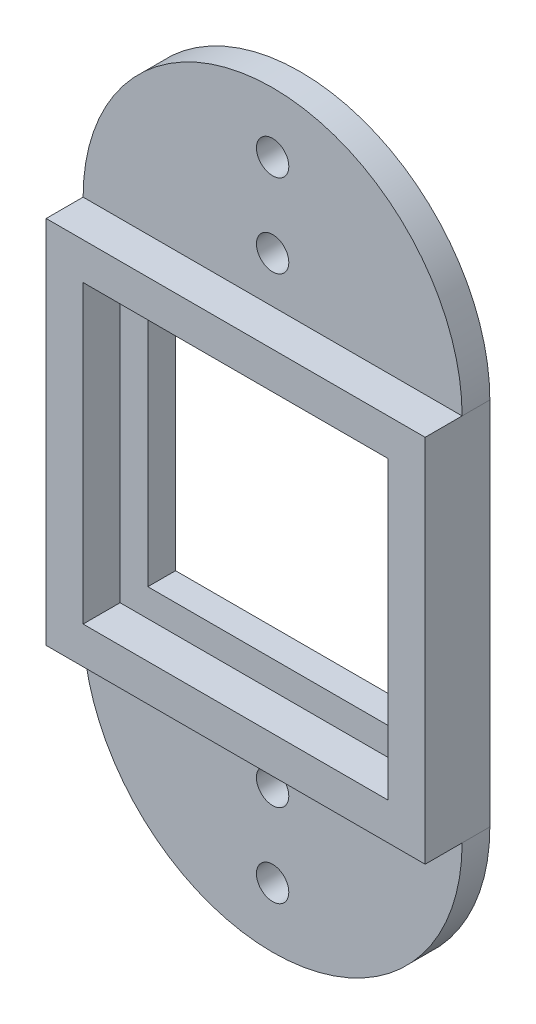
ISO-10303-21;
HEADER;
FILE_DESCRIPTION(('STEP AP214'),'2;1');
FILE_NAME('part.step','',(''),(''),'','','');
FILE_SCHEMA(('AUTOMOTIVE_DESIGN { 1 0 10303 214 1 1 1 1 }'));
ENDSEC;
DATA;
#1=APPLICATION_CONTEXT('core data for automotive mechanical design processes');
#2=APPLICATION_PROTOCOL_DEFINITION('international standard','automotive_design',2000,#1);
#3=PRODUCT_CONTEXT('',#1,'mechanical');
#4=PRODUCT('Part','Part','',(#3));
#5=PRODUCT_RELATED_PRODUCT_CATEGORY('part','',(#4));
#6=PRODUCT_DEFINITION_FORMATION('','',#4);
#7=PRODUCT_DEFINITION_CONTEXT('part definition',#1,'design');
#8=PRODUCT_DEFINITION('design','',#6,#7);
#9=PRODUCT_DEFINITION_SHAPE('','',#8);
#10=(LENGTH_UNIT() NAMED_UNIT(*) SI_UNIT(.MILLI.,.METRE.));
#11=(NAMED_UNIT(*) PLANE_ANGLE_UNIT() SI_UNIT($,.RADIAN.));
#12=(NAMED_UNIT(*) SI_UNIT($,.STERADIAN.) SOLID_ANGLE_UNIT());
#13=UNCERTAINTY_MEASURE_WITH_UNIT(LENGTH_MEASURE(1.E-05),#10,'distance_accuracy_value','');
#14=(GEOMETRIC_REPRESENTATION_CONTEXT(3) GLOBAL_UNCERTAINTY_ASSIGNED_CONTEXT((#13)) GLOBAL_UNIT_ASSIGNED_CONTEXT((#10,
#11,#12)) REPRESENTATION_CONTEXT('',''));
#15=CARTESIAN_POINT('',(0.,0.,0.));
#16=DIRECTION('',(0.,0.,1.));
#17=DIRECTION('',(1.,0.,0.));
#18=AXIS2_PLACEMENT_3D('',#15,#16,#17);
#19=CARTESIAN_POINT('',(0.,0.,7.));
#20=DIRECTION('',(0.,1.,0.));
#21=DIRECTION('',(0.,0.,1.));
#22=AXIS2_PLACEMENT_3D('',#19,#20,#21);
#23=PLANE('',#22);
#24=DIRECTION('',(0.,0.,-1.));
#25=VECTOR('',#24,1.);
#26=CARTESIAN_POINT('',(33.,0.,7.));
#27=LINE('',#26,#25);
#28=CARTESIAN_POINT('',(33.,0.,7.));
#29=VERTEX_POINT('',#28);
#30=CARTESIAN_POINT('',(33.,0.,3.));
#31=VERTEX_POINT('',#30);
#32=EDGE_CURVE('E200',#29,#31,#27,.T.);
#33=ORIENTED_EDGE('',*,*,#32,.T.);
#34=DIRECTION('',(1.,0.,0.));
#35=VECTOR('',#34,1.);
#36=CARTESIAN_POINT('',(0.,0.,3.));
#37=LINE('',#36,#35);
#38=CARTESIAN_POINT('',(0.,0.,3.));
#39=VERTEX_POINT('',#38);
#40=EDGE_CURVE('E275',#39,#31,#37,.T.);
#41=ORIENTED_EDGE('',*,*,#40,.F.);
#42=DIRECTION('',(0.,0.,-1.));
#43=VECTOR('',#42,1.);
#44=CARTESIAN_POINT('',(0.,0.,7.));
#45=LINE('',#44,#43);
#46=CARTESIAN_POINT('',(0.,0.,7.));
#47=VERTEX_POINT('',#46);
#48=EDGE_CURVE('E301',#47,#39,#45,.T.);
#49=ORIENTED_EDGE('',*,*,#48,.F.);
#50=DIRECTION('',(1.,0.,0.));
#51=VECTOR('',#50,1.);
#52=CARTESIAN_POINT('',(0.,0.,7.));
#53=LINE('',#52,#51);
#54=EDGE_CURVE('E291',#47,#29,#53,.T.);
#55=ORIENTED_EDGE('',*,*,#54,.T.);
#56=EDGE_LOOP('',(#33,#41,#49,#55));
#57=FACE_BOUND('',#56,.T.);
#58=ADVANCED_FACE('F89',(#57),#23,.T.);
#59=CARTESIAN_POINT('',(33.,32.,7.));
#60=DIRECTION('',(1.,0.,0.));
#61=DIRECTION('',(0.,1.,0.));
#62=AXIS2_PLACEMENT_3D('',#59,#60,#61);
#63=PLANE('',#62);
#64=DIRECTION('',(0.,-1.,0.));
#65=VECTOR('',#64,1.);
#66=CARTESIAN_POINT('',(33.,32.,3.));
#67=LINE('',#66,#65);
#68=CARTESIAN_POINT('',(33.,32.,3.));
#69=VERTEX_POINT('',#68);
#70=EDGE_CURVE('E283',#69,#31,#67,.T.);
#71=ORIENTED_EDGE('',*,*,#70,.T.);
#72=ORIENTED_EDGE('',*,*,#32,.F.);
#73=DIRECTION('',(0.,-1.,0.));
#74=VECTOR('',#73,1.);
#75=CARTESIAN_POINT('',(33.,32.,7.));
#76=LINE('',#75,#74);
#77=CARTESIAN_POINT('',(33.,32.,7.));
#78=VERTEX_POINT('',#77);
#79=EDGE_CURVE('E293',#78,#29,#76,.T.);
#80=ORIENTED_EDGE('',*,*,#79,.F.);
#81=DIRECTION('',(0.,0.,-1.));
#82=VECTOR('',#81,1.);
#83=CARTESIAN_POINT('',(33.,32.,7.));
#84=LINE('',#83,#82);
#85=EDGE_CURVE('E307',#78,#69,#84,.T.);
#86=ORIENTED_EDGE('',*,*,#85,.T.);
#87=EDGE_LOOP('',(#71,#72,#80,#86));
#88=FACE_BOUND('',#87,.T.);
#89=ADVANCED_FACE('F362',(#88),#63,.F.);
#90=CARTESIAN_POINT('',(0.,32.,7.));
#91=DIRECTION('',(0.,1.,0.));
#92=DIRECTION('',(0.,0.,1.));
#93=AXIS2_PLACEMENT_3D('',#90,#91,#92);
#94=PLANE('',#93);
#95=DIRECTION('',(1.,0.,0.));
#96=VECTOR('',#95,1.);
#97=CARTESIAN_POINT('',(0.,32.,3.));
#98=LINE('',#97,#96);
#99=CARTESIAN_POINT('',(0.,32.,3.));
#100=VERTEX_POINT('',#99);
#101=EDGE_CURVE('E286',#100,#69,#98,.T.);
#102=ORIENTED_EDGE('',*,*,#101,.T.);
#103=ORIENTED_EDGE('',*,*,#85,.F.);
#104=DIRECTION('',(1.,0.,0.));
#105=VECTOR('',#104,1.);
#106=CARTESIAN_POINT('',(0.,32.,7.));
#107=LINE('',#106,#105);
#108=CARTESIAN_POINT('',(0.,32.,7.));
#109=VERTEX_POINT('',#108);
#110=EDGE_CURVE('E296',#109,#78,#107,.T.);
#111=ORIENTED_EDGE('',*,*,#110,.F.);
#112=DIRECTION('',(0.,0.,-1.));
#113=VECTOR('',#112,1.);
#114=CARTESIAN_POINT('',(0.,32.,7.));
#115=LINE('',#114,#113);
#116=EDGE_CURVE('E304',#109,#100,#115,.T.);
#117=ORIENTED_EDGE('',*,*,#116,.T.);
#118=EDGE_LOOP('',(#102,#103,#111,#117));
#119=FACE_BOUND('',#118,.T.);
#120=ADVANCED_FACE('F369',(#119),#94,.F.);
#121=CARTESIAN_POINT('',(0.,32.,7.));
#122=DIRECTION('',(1.,0.,0.));
#123=DIRECTION('',(0.,1.,0.));
#124=AXIS2_PLACEMENT_3D('',#121,#122,#123);
#125=PLANE('',#124);
#126=ORIENTED_EDGE('',*,*,#48,.T.);
#127=DIRECTION('',(0.,-1.,0.));
#128=VECTOR('',#127,1.);
#129=CARTESIAN_POINT('',(0.,32.,3.));
#130=LINE('',#129,#128);
#131=EDGE_CURVE('E289',#100,#39,#130,.T.);
#132=ORIENTED_EDGE('',*,*,#131,.F.);
#133=ORIENTED_EDGE('',*,*,#116,.F.);
#134=DIRECTION('',(0.,-1.,0.));
#135=VECTOR('',#134,1.);
#136=CARTESIAN_POINT('',(0.,32.,7.));
#137=LINE('',#136,#135);
#138=EDGE_CURVE('E299',#109,#47,#137,.T.);
#139=ORIENTED_EDGE('',*,*,#138,.T.);
#140=EDGE_LOOP('',(#126,#132,#133,#139));
#141=FACE_BOUND('',#140,.T.);
#142=ADVANCED_FACE('F374',(#141),#125,.T.);
#143=CARTESIAN_POINT('',(0.,0.,7.));
#144=DIRECTION('',(0.,0.,1.));
#145=DIRECTION('',(1.,0.,0.));
#146=AXIS2_PLACEMENT_3D('',#143,#144,#145);
#147=PLANE('',#146);
#148=DIRECTION('',(-1.,0.,0.));
#149=VECTOR('',#148,1.);
#150=CARTESIAN_POINT('',(37.,-4.,7.));
#151=LINE('',#150,#149);
#152=CARTESIAN_POINT('',(37.,-4.,7.));
#153=VERTEX_POINT('',#152);
#154=CARTESIAN_POINT('',(-4.,-3.99999999999998,7.));
#155=VERTEX_POINT('',#154);
#156=EDGE_CURVE('E312',#153,#155,#151,.T.);
#157=ORIENTED_EDGE('',*,*,#156,.F.);
#158=DIRECTION('',(0.,-1.,0.));
#159=VECTOR('',#158,1.);
#160=CARTESIAN_POINT('',(37.,36.,7.));
#161=LINE('',#160,#159);
#162=CARTESIAN_POINT('',(37.,36.,7.));
#163=VERTEX_POINT('',#162);
#164=EDGE_CURVE('E319',#163,#153,#161,.T.);
#165=ORIENTED_EDGE('',*,*,#164,.F.);
#166=DIRECTION('',(-1.,0.,0.));
#167=VECTOR('',#166,1.);
#168=CARTESIAN_POINT('',(37.,36.,7.));
#169=LINE('',#168,#167);
#170=CARTESIAN_POINT('',(-4.,36.,7.));
#171=VERTEX_POINT('',#170);
#172=EDGE_CURVE('E317',#163,#171,#169,.T.);
#173=ORIENTED_EDGE('',*,*,#172,.T.);
#174=DIRECTION('',(0.,-1.,0.));
#175=VECTOR('',#174,1.);
#176=CARTESIAN_POINT('',(-4.,36.,7.));
#177=LINE('',#176,#175);
#178=EDGE_CURVE('E315',#171,#155,#177,.T.);
#179=ORIENTED_EDGE('',*,*,#178,.T.);
#180=EDGE_LOOP('',(#157,#165,#173,#179));
#181=FACE_BOUND('',#180,.T.);
#182=ORIENTED_EDGE('',*,*,#79,.T.);
#183=ORIENTED_EDGE('',*,*,#54,.F.);
#184=ORIENTED_EDGE('',*,*,#138,.F.);
#185=ORIENTED_EDGE('',*,*,#110,.T.);
#186=EDGE_LOOP('',(#182,#183,#184,#185));
#187=FACE_BOUND('',#186,.T.);
#188=ADVANCED_FACE('F348',(#181,#187),#147,.T.);
#189=CARTESIAN_POINT('',(0.,0.,0.));
#190=DIRECTION('',(0.,0.,1.));
#191=DIRECTION('',(1.,0.,0.));
#192=AXIS2_PLACEMENT_3D('',#189,#190,#191);
#193=PLANE('',#192);
#194=DIRECTION('',(0.,-1.,0.));
#195=VECTOR('',#194,1.);
#196=CARTESIAN_POINT('',(37.,36.,0.));
#197=LINE('',#196,#195);
#198=CARTESIAN_POINT('',(37.,36.,0.));
#199=VERTEX_POINT('',#198);
#200=CARTESIAN_POINT('',(37.,-4.,0.));
#201=VERTEX_POINT('',#200);
#202=EDGE_CURVE('E199',#199,#201,#197,.T.);
#203=ORIENTED_EDGE('',*,*,#202,.T.);
#204=CARTESIAN_POINT('',(16.5,-4.,0.));
#205=DIRECTION('',(0.,0.,1.));
#206=DIRECTION('',(1.,0.,0.));
#207=AXIS2_PLACEMENT_3D('',#204,#205,#206);
#208=CIRCLE('',#207,20.5);
#209=CARTESIAN_POINT('',(-4.,-3.99999999999998,0.));
#210=VERTEX_POINT('',#209);
#211=EDGE_CURVE('E207',#201,#210,#208,.F.);
#212=ORIENTED_EDGE('',*,*,#211,.T.);
#213=DIRECTION('',(0.,-1.,0.));
#214=VECTOR('',#213,1.);
#215=CARTESIAN_POINT('',(-4.,36.,0.));
#216=LINE('',#215,#214);
#217=CARTESIAN_POINT('',(-4.,36.,0.));
#218=VERTEX_POINT('',#217);
#219=EDGE_CURVE('E191',#218,#210,#216,.T.);
#220=ORIENTED_EDGE('',*,*,#219,.F.);
#221=CARTESIAN_POINT('',(16.5,36.,0.));
#222=DIRECTION('',(0.,0.,1.));
#223=DIRECTION('',(1.,0.,0.));
#224=AXIS2_PLACEMENT_3D('',#221,#222,#223);
#225=CIRCLE('',#224,20.5);
#226=EDGE_CURVE('E234',#199,#218,#225,.T.);
#227=ORIENTED_EDGE('',*,*,#226,.F.);
#228=EDGE_LOOP('',(#203,#212,#220,#227));
#229=FACE_BOUND('',#228,.T.);
#230=DIRECTION('',(1.,0.,0.));
#231=VECTOR('',#230,1.);
#232=CARTESIAN_POINT('',(3.,29.,0.));
#233=LINE('',#232,#231);
#234=CARTESIAN_POINT('',(3.,29.,0.));
#235=VERTEX_POINT('',#234);
#236=CARTESIAN_POINT('',(30.,29.,0.));
#237=VERTEX_POINT('',#236);
#238=EDGE_CURVE('E229',#235,#237,#233,.T.);
#239=ORIENTED_EDGE('',*,*,#238,.F.);
#240=DIRECTION('',(0.,1.,0.));
#241=VECTOR('',#240,1.);
#242=CARTESIAN_POINT('',(3.,3.,0.));
#243=LINE('',#242,#241);
#244=CARTESIAN_POINT('',(3.,3.,0.));
#245=VERTEX_POINT('',#244);
#246=EDGE_CURVE('E255',#245,#235,#243,.T.);
#247=ORIENTED_EDGE('',*,*,#246,.F.);
#248=DIRECTION('',(1.,0.,0.));
#249=VECTOR('',#248,1.);
#250=CARTESIAN_POINT('',(3.,3.,0.));
#251=LINE('',#250,#249);
#252=CARTESIAN_POINT('',(30.,3.,0.));
#253=VERTEX_POINT('',#252);
#254=EDGE_CURVE('E268',#245,#253,#251,.T.);
#255=ORIENTED_EDGE('',*,*,#254,.T.);
#256=DIRECTION('',(0.,1.,0.));
#257=VECTOR('',#256,1.);
#258=CARTESIAN_POINT('',(30.,3.,0.));
#259=LINE('',#258,#257);
#260=EDGE_CURVE('E265',#253,#237,#259,.T.);
#261=ORIENTED_EDGE('',*,*,#260,.T.);
#262=EDGE_LOOP('',(#239,#247,#255,#261));
#263=FACE_BOUND('',#262,.T.);
#264=CARTESIAN_POINT('',(16.5,50.,0.));
#265=DIRECTION('',(0.,0.,1.));
#266=DIRECTION('',(1.,0.,0.));
#267=AXIS2_PLACEMENT_3D('',#264,#265,#266);
#268=CIRCLE('',#267,1.75);
#269=CARTESIAN_POINT('',(18.25,50.,0.));
#270=VERTEX_POINT('',#269);
#271=EDGE_CURVE('E242',#270,#270,#268,.T.);
#272=ORIENTED_EDGE('',*,*,#271,.T.);
#273=EDGE_LOOP('',(#272));
#274=FACE_BOUND('',#273,.T.);
#275=CARTESIAN_POINT('',(16.5,41.,0.));
#276=DIRECTION('',(0.,0.,1.));
#277=DIRECTION('',(1.,0.,0.));
#278=AXIS2_PLACEMENT_3D('',#275,#276,#277);
#279=CIRCLE('',#278,1.75);
#280=CARTESIAN_POINT('',(18.25,41.,0.));
#281=VERTEX_POINT('',#280);
#282=EDGE_CURVE('E245',#281,#281,#279,.T.);
#283=ORIENTED_EDGE('',*,*,#282,.T.);
#284=EDGE_LOOP('',(#283));
#285=FACE_BOUND('',#284,.T.);
#286=CARTESIAN_POINT('',(16.5,-9.,0.));
#287=DIRECTION('',(0.,0.,1.));
#288=DIRECTION('',(1.,0.,0.));
#289=AXIS2_PLACEMENT_3D('',#286,#287,#288);
#290=CIRCLE('',#289,1.75);
#291=CARTESIAN_POINT('',(18.25,-9.,0.));
#292=VERTEX_POINT('',#291);
#293=EDGE_CURVE('E218',#292,#292,#290,.F.);
#294=ORIENTED_EDGE('',*,*,#293,.F.);
#295=EDGE_LOOP('',(#294));
#296=FACE_BOUND('',#295,.T.);
#297=CARTESIAN_POINT('',(16.5,-18.,0.));
#298=DIRECTION('',(0.,0.,1.));
#299=DIRECTION('',(1.,0.,0.));
#300=AXIS2_PLACEMENT_3D('',#297,#298,#299);
#301=CIRCLE('',#300,1.75);
#302=CARTESIAN_POINT('',(18.25,-18.,0.));
#303=VERTEX_POINT('',#302);
#304=EDGE_CURVE('E217',#303,#303,#301,.F.);
#305=ORIENTED_EDGE('',*,*,#304,.F.);
#306=EDGE_LOOP('',(#305));
#307=FACE_BOUND('',#306,.T.);
#308=ADVANCED_FACE('F214',(#229,#263,#274,#285,#296,#307),#193,.F.);
#309=CARTESIAN_POINT('',(37.,-4.,7.));
#310=DIRECTION('',(0.,-1.,0.));
#311=DIRECTION('',(1.,0.,0.));
#312=AXIS2_PLACEMENT_3D('',#309,#310,#311);
#313=PLANE('',#312);
#314=DIRECTION('',(-1.,0.,0.));
#315=VECTOR('',#314,1.);
#316=CARTESIAN_POINT('',(0.,-3.99999999999998,3.));
#317=LINE('',#316,#315);
#318=CARTESIAN_POINT('',(37.,-4.,3.));
#319=VERTEX_POINT('',#318);
#320=CARTESIAN_POINT('',(-4.,-3.99999999999998,3.));
#321=VERTEX_POINT('',#320);
#322=EDGE_CURVE('E106',#319,#321,#317,.T.);
#323=ORIENTED_EDGE('',*,*,#322,.F.);
#324=DIRECTION('',(0.,0.,-1.));
#325=VECTOR('',#324,1.);
#326=CARTESIAN_POINT('',(37.,-4.,7.));
#327=LINE('',#326,#325);
#328=EDGE_CURVE('E12',#153,#319,#327,.T.);
#329=ORIENTED_EDGE('',*,*,#328,.F.);
#330=ORIENTED_EDGE('',*,*,#156,.T.);
#331=DIRECTION('',(0.,0.,-1.));
#332=VECTOR('',#331,1.);
#333=CARTESIAN_POINT('',(-4.,-3.99999999999998,7.));
#334=LINE('',#333,#332);
#335=EDGE_CURVE('E93',#155,#321,#334,.T.);
#336=ORIENTED_EDGE('',*,*,#335,.T.);
#337=EDGE_LOOP('',(#323,#329,#330,#336));
#338=FACE_BOUND('',#337,.T.);
#339=ADVANCED_FACE('F91',(#338),#313,.T.);
#340=CARTESIAN_POINT('',(37.,36.,7.));
#341=DIRECTION('',(1.,0.,0.));
#342=DIRECTION('',(0.,0.,-1.));
#343=AXIS2_PLACEMENT_3D('',#340,#341,#342);
#344=PLANE('',#343);
#345=ORIENTED_EDGE('',*,*,#202,.F.);
#346=DIRECTION('',(0.,0.,-1.));
#347=VECTOR('',#346,1.);
#348=CARTESIAN_POINT('',(37.,36.,3.));
#349=LINE('',#348,#347);
#350=CARTESIAN_POINT('',(37.,36.,3.));
#351=VERTEX_POINT('',#350);
#352=EDGE_CURVE('E224',#351,#199,#349,.T.);
#353=ORIENTED_EDGE('',*,*,#352,.F.);
#354=DIRECTION('',(0.,0.,-1.));
#355=VECTOR('',#354,1.);
#356=CARTESIAN_POINT('',(37.,36.,7.));
#357=LINE('',#356,#355);
#358=EDGE_CURVE('E98',#163,#351,#357,.T.);
#359=ORIENTED_EDGE('',*,*,#358,.F.);
#360=ORIENTED_EDGE('',*,*,#164,.T.);
#361=ORIENTED_EDGE('',*,*,#328,.T.);
#362=DIRECTION('',(0.,0.,-1.));
#363=VECTOR('',#362,1.);
#364=CARTESIAN_POINT('',(37.,-4.,3.));
#365=LINE('',#364,#363);
#366=EDGE_CURVE('E210',#319,#201,#365,.T.);
#367=ORIENTED_EDGE('',*,*,#366,.T.);
#368=EDGE_LOOP('',(#345,#353,#359,#360,#361,#367));
#369=FACE_BOUND('',#368,.T.);
#370=ADVANCED_FACE('F377',(#369),#344,.T.);
#371=CARTESIAN_POINT('',(37.,36.,7.));
#372=DIRECTION('',(0.,-1.,0.));
#373=DIRECTION('',(0.,0.,-1.));
#374=AXIS2_PLACEMENT_3D('',#371,#372,#373);
#375=PLANE('',#374);
#376=ORIENTED_EDGE('',*,*,#358,.T.);
#377=DIRECTION('',(-1.,0.,0.));
#378=VECTOR('',#377,1.);
#379=CARTESIAN_POINT('',(0.,36.,3.));
#380=LINE('',#379,#378);
#381=CARTESIAN_POINT('',(-4.,36.,3.));
#382=VERTEX_POINT('',#381);
#383=EDGE_CURVE('E237',#351,#382,#380,.T.);
#384=ORIENTED_EDGE('',*,*,#383,.T.);
#385=DIRECTION('',(0.,0.,-1.));
#386=VECTOR('',#385,1.);
#387=CARTESIAN_POINT('',(-4.,36.,7.));
#388=LINE('',#387,#386);
#389=EDGE_CURVE('E324',#171,#382,#388,.T.);
#390=ORIENTED_EDGE('',*,*,#389,.F.);
#391=ORIENTED_EDGE('',*,*,#172,.F.);
#392=EDGE_LOOP('',(#376,#384,#390,#391));
#393=FACE_BOUND('',#392,.T.);
#394=ADVANCED_FACE('F380',(#393),#375,.F.);
#395=CARTESIAN_POINT('',(-4.,36.,7.));
#396=DIRECTION('',(1.,0.,0.));
#397=DIRECTION('',(0.,1.,0.));
#398=AXIS2_PLACEMENT_3D('',#395,#396,#397);
#399=PLANE('',#398);
#400=ORIENTED_EDGE('',*,*,#219,.T.);
#401=DIRECTION('',(0.,0.,-1.));
#402=VECTOR('',#401,1.);
#403=CARTESIAN_POINT('',(-4.,-3.99999999999998,3.));
#404=LINE('',#403,#402);
#405=EDGE_CURVE('E113',#321,#210,#404,.T.);
#406=ORIENTED_EDGE('',*,*,#405,.F.);
#407=ORIENTED_EDGE('',*,*,#335,.F.);
#408=ORIENTED_EDGE('',*,*,#178,.F.);
#409=ORIENTED_EDGE('',*,*,#389,.T.);
#410=DIRECTION('',(0.,0.,-1.));
#411=VECTOR('',#410,1.);
#412=CARTESIAN_POINT('',(-4.,36.,3.));
#413=LINE('',#412,#411);
#414=EDGE_CURVE('E195',#382,#218,#413,.T.);
#415=ORIENTED_EDGE('',*,*,#414,.T.);
#416=EDGE_LOOP('',(#400,#406,#407,#408,#409,#415));
#417=FACE_BOUND('',#416,.T.);
#418=ADVANCED_FACE('F192',(#417),#399,.F.);
#419=CARTESIAN_POINT('',(0.,0.,3.));
#420=DIRECTION('',(0.,0.,-1.));
#421=DIRECTION('',(-1.,0.,0.));
#422=AXIS2_PLACEMENT_3D('',#419,#420,#421);
#423=PLANE('',#422);
#424=DIRECTION('',(0.,1.,0.));
#425=VECTOR('',#424,1.);
#426=CARTESIAN_POINT('',(3.,3.,3.));
#427=LINE('',#426,#425);
#428=CARTESIAN_POINT('',(3.,3.,3.));
#429=VERTEX_POINT('',#428);
#430=CARTESIAN_POINT('',(3.,29.,3.));
#431=VERTEX_POINT('',#430);
#432=EDGE_CURVE('E260',#429,#431,#427,.T.);
#433=ORIENTED_EDGE('',*,*,#432,.T.);
#434=DIRECTION('',(1.,0.,0.));
#435=VECTOR('',#434,1.);
#436=CARTESIAN_POINT('',(3.,29.,3.));
#437=LINE('',#436,#435);
#438=CARTESIAN_POINT('',(30.,29.,3.));
#439=VERTEX_POINT('',#438);
#440=EDGE_CURVE('E251',#431,#439,#437,.T.);
#441=ORIENTED_EDGE('',*,*,#440,.T.);
#442=DIRECTION('',(0.,1.,0.));
#443=VECTOR('',#442,1.);
#444=CARTESIAN_POINT('',(30.,3.,3.));
#445=LINE('',#444,#443);
#446=CARTESIAN_POINT('',(30.,3.,3.));
#447=VERTEX_POINT('',#446);
#448=EDGE_CURVE('E254',#447,#439,#445,.T.);
#449=ORIENTED_EDGE('',*,*,#448,.F.);
#450=DIRECTION('',(1.,0.,0.));
#451=VECTOR('',#450,1.);
#452=CARTESIAN_POINT('',(3.,3.,3.));
#453=LINE('',#452,#451);
#454=EDGE_CURVE('E257',#429,#447,#453,.T.);
#455=ORIENTED_EDGE('',*,*,#454,.F.);
#456=EDGE_LOOP('',(#433,#441,#449,#455));
#457=FACE_BOUND('',#456,.T.);
#458=ORIENTED_EDGE('',*,*,#40,.T.);
#459=ORIENTED_EDGE('',*,*,#70,.F.);
#460=ORIENTED_EDGE('',*,*,#101,.F.);
#461=ORIENTED_EDGE('',*,*,#131,.T.);
#462=EDGE_LOOP('',(#458,#459,#460,#461));
#463=FACE_BOUND('',#462,.T.);
#464=ADVANCED_FACE('F385',(#457,#463),#423,.F.);
#465=CARTESIAN_POINT('',(3.,29.,3.));
#466=DIRECTION('',(0.,1.,0.));
#467=DIRECTION('',(0.,0.,1.));
#468=AXIS2_PLACEMENT_3D('',#465,#466,#467);
#469=PLANE('',#468);
#470=ORIENTED_EDGE('',*,*,#238,.T.);
#471=DIRECTION('',(0.,0.,-1.));
#472=VECTOR('',#471,1.);
#473=CARTESIAN_POINT('',(30.,29.,3.));
#474=LINE('',#473,#472);
#475=EDGE_CURVE('E263',#439,#237,#474,.T.);
#476=ORIENTED_EDGE('',*,*,#475,.F.);
#477=ORIENTED_EDGE('',*,*,#440,.F.);
#478=DIRECTION('',(0.,0.,-1.));
#479=VECTOR('',#478,1.);
#480=CARTESIAN_POINT('',(3.,29.,3.));
#481=LINE('',#480,#479);
#482=EDGE_CURVE('E273',#431,#235,#481,.T.);
#483=ORIENTED_EDGE('',*,*,#482,.T.);
#484=EDGE_LOOP('',(#470,#476,#477,#483));
#485=FACE_BOUND('',#484,.T.);
#486=ADVANCED_FACE('F390',(#485),#469,.F.);
#487=CARTESIAN_POINT('',(3.,3.,3.));
#488=DIRECTION('',(-1.,0.,0.));
#489=DIRECTION('',(0.,0.,1.));
#490=AXIS2_PLACEMENT_3D('',#487,#488,#489);
#491=PLANE('',#490);
#492=ORIENTED_EDGE('',*,*,#246,.T.);
#493=ORIENTED_EDGE('',*,*,#482,.F.);
#494=ORIENTED_EDGE('',*,*,#432,.F.);
#495=DIRECTION('',(0.,0.,-1.));
#496=VECTOR('',#495,1.);
#497=CARTESIAN_POINT('',(3.,3.,3.));
#498=LINE('',#497,#496);
#499=EDGE_CURVE('E276',#429,#245,#498,.T.);
#500=ORIENTED_EDGE('',*,*,#499,.T.);
#501=EDGE_LOOP('',(#492,#493,#494,#500));
#502=FACE_BOUND('',#501,.T.);
#503=ADVANCED_FACE('F397',(#502),#491,.F.);
#504=CARTESIAN_POINT('',(3.,3.,3.));
#505=DIRECTION('',(0.,1.,0.));
#506=DIRECTION('',(0.,0.,1.));
#507=AXIS2_PLACEMENT_3D('',#504,#505,#506);
#508=PLANE('',#507);
#509=ORIENTED_EDGE('',*,*,#254,.F.);
#510=ORIENTED_EDGE('',*,*,#499,.F.);
#511=ORIENTED_EDGE('',*,*,#454,.T.);
#512=DIRECTION('',(0.,0.,-1.));
#513=VECTOR('',#512,1.);
#514=CARTESIAN_POINT('',(30.,3.,3.));
#515=LINE('',#514,#513);
#516=EDGE_CURVE('E278',#447,#253,#515,.T.);
#517=ORIENTED_EDGE('',*,*,#516,.T.);
#518=EDGE_LOOP('',(#509,#510,#511,#517));
#519=FACE_BOUND('',#518,.T.);
#520=ADVANCED_FACE('F486',(#519),#508,.T.);
#521=CARTESIAN_POINT('',(30.,3.,3.));
#522=DIRECTION('',(-1.,0.,0.));
#523=DIRECTION('',(0.,0.,1.));
#524=AXIS2_PLACEMENT_3D('',#521,#522,#523);
#525=PLANE('',#524);
#526=ORIENTED_EDGE('',*,*,#260,.F.);
#527=ORIENTED_EDGE('',*,*,#516,.F.);
#528=ORIENTED_EDGE('',*,*,#448,.T.);
#529=ORIENTED_EDGE('',*,*,#475,.T.);
#530=EDGE_LOOP('',(#526,#527,#528,#529));
#531=FACE_BOUND('',#530,.T.);
#532=ADVANCED_FACE('F495',(#531),#525,.T.);
#533=CARTESIAN_POINT('',(16.5,41.,3.));
#534=DIRECTION('',(0.,0.,-1.));
#535=DIRECTION('',(-1.,0.,0.));
#536=AXIS2_PLACEMENT_3D('',#533,#534,#535);
#537=CYLINDRICAL_SURFACE('',#536,1.75);
#538=CARTESIAN_POINT('',(16.5,41.,3.));
#539=DIRECTION('',(0.,0.,1.));
#540=DIRECTION('',(1.,0.,0.));
#541=AXIS2_PLACEMENT_3D('',#538,#539,#540);
#542=CIRCLE('',#541,1.75);
#543=CARTESIAN_POINT('',(18.25,41.,3.));
#544=VERTEX_POINT('',#543);
#545=EDGE_CURVE('E233',#544,#544,#542,.T.);
#546=ORIENTED_EDGE('',*,*,#545,.T.);
#547=EDGE_LOOP('',(#546));
#548=FACE_BOUND('',#547,.T.);
#549=ORIENTED_EDGE('',*,*,#282,.F.);
#550=EDGE_LOOP('',(#549));
#551=FACE_BOUND('',#550,.T.);
#552=ADVANCED_FACE('F504',(#548,#551),#537,.F.);
#553=CARTESIAN_POINT('',(16.5,50.,3.));
#554=DIRECTION('',(0.,0.,-1.));
#555=DIRECTION('',(-1.,0.,0.));
#556=AXIS2_PLACEMENT_3D('',#553,#554,#555);
#557=CYLINDRICAL_SURFACE('',#556,1.75);
#558=CARTESIAN_POINT('',(16.5,50.,3.));
#559=DIRECTION('',(0.,0.,1.));
#560=DIRECTION('',(1.,0.,0.));
#561=AXIS2_PLACEMENT_3D('',#558,#559,#560);
#562=CIRCLE('',#561,1.75);
#563=CARTESIAN_POINT('',(18.25,50.,3.));
#564=VERTEX_POINT('',#563);
#565=EDGE_CURVE('E230',#564,#564,#562,.T.);
#566=ORIENTED_EDGE('',*,*,#565,.T.);
#567=EDGE_LOOP('',(#566));
#568=FACE_BOUND('',#567,.T.);
#569=ORIENTED_EDGE('',*,*,#271,.F.);
#570=EDGE_LOOP('',(#569));
#571=FACE_BOUND('',#570,.T.);
#572=ADVANCED_FACE('F519',(#568,#571),#557,.F.);
#573=CARTESIAN_POINT('',(16.5,36.,3.));
#574=DIRECTION('',(0.,0.,-1.));
#575=DIRECTION('',(-1.,0.,0.));
#576=AXIS2_PLACEMENT_3D('',#573,#574,#575);
#577=CYLINDRICAL_SURFACE('',#576,20.5);
#578=ORIENTED_EDGE('',*,*,#226,.T.);
#579=ORIENTED_EDGE('',*,*,#414,.F.);
#580=CARTESIAN_POINT('',(16.5,36.,3.));
#581=DIRECTION('',(0.,0.,1.));
#582=DIRECTION('',(1.,0.,0.));
#583=AXIS2_PLACEMENT_3D('',#580,#581,#582);
#584=CIRCLE('',#583,20.5);
#585=EDGE_CURVE('E240',#351,#382,#584,.T.);
#586=ORIENTED_EDGE('',*,*,#585,.F.);
#587=ORIENTED_EDGE('',*,*,#352,.T.);
#588=EDGE_LOOP('',(#578,#579,#586,#587));
#589=FACE_BOUND('',#588,.T.);
#590=ADVANCED_FACE('F529',(#589),#577,.T.);
#591=CARTESIAN_POINT('',(0.,0.,3.));
#592=DIRECTION('',(0.,0.,1.));
#593=DIRECTION('',(1.,0.,0.));
#594=AXIS2_PLACEMENT_3D('',#591,#592,#593);
#595=PLANE('',#594);
#596=ORIENTED_EDGE('',*,*,#565,.F.);
#597=EDGE_LOOP('',(#596));
#598=FACE_BOUND('',#597,.T.);
#599=ORIENTED_EDGE('',*,*,#545,.F.);
#600=EDGE_LOOP('',(#599));
#601=FACE_BOUND('',#600,.T.);
#602=ORIENTED_EDGE('',*,*,#383,.F.);
#603=ORIENTED_EDGE('',*,*,#585,.T.);
#604=EDGE_LOOP('',(#602,#603));
#605=FACE_BOUND('',#604,.T.);
#606=ADVANCED_FACE('F539',(#598,#601,#605),#595,.T.);
#607=CARTESIAN_POINT('',(16.5,-4.,3.));
#608=DIRECTION('',(0.,0.,-1.));
#609=DIRECTION('',(-1.,0.,0.));
#610=AXIS2_PLACEMENT_3D('',#607,#608,#609);
#611=CYLINDRICAL_SURFACE('',#610,20.5);
#612=ORIENTED_EDGE('',*,*,#211,.F.);
#613=ORIENTED_EDGE('',*,*,#366,.F.);
#614=CARTESIAN_POINT('',(16.5,-4.,3.));
#615=DIRECTION('',(0.,0.,1.));
#616=DIRECTION('',(1.,0.,0.));
#617=AXIS2_PLACEMENT_3D('',#614,#615,#616);
#618=CIRCLE('',#617,20.5);
#619=EDGE_CURVE('E209',#319,#321,#618,.F.);
#620=ORIENTED_EDGE('',*,*,#619,.T.);
#621=ORIENTED_EDGE('',*,*,#405,.T.);
#622=EDGE_LOOP('',(#612,#613,#620,#621));
#623=FACE_BOUND('',#622,.T.);
#624=ADVANCED_FACE('F205',(#623),#611,.T.);
#625=CARTESIAN_POINT('',(16.5,-9.,3.));
#626=DIRECTION('',(0.,0.,-1.));
#627=DIRECTION('',(-1.,0.,0.));
#628=AXIS2_PLACEMENT_3D('',#625,#626,#627);
#629=CYLINDRICAL_SURFACE('',#628,1.75);
#630=CARTESIAN_POINT('',(16.5,-9.,3.));
#631=DIRECTION('',(0.,0.,1.));
#632=DIRECTION('',(1.,0.,0.));
#633=AXIS2_PLACEMENT_3D('',#630,#631,#632);
#634=CIRCLE('',#633,1.75);
#635=CARTESIAN_POINT('',(18.25,-9.,3.));
#636=VERTEX_POINT('',#635);
#637=EDGE_CURVE('E221',#636,#636,#634,.F.);
#638=ORIENTED_EDGE('',*,*,#637,.F.);
#639=EDGE_LOOP('',(#638));
#640=FACE_BOUND('',#639,.T.);
#641=ORIENTED_EDGE('',*,*,#293,.T.);
#642=EDGE_LOOP('',(#641));
#643=FACE_BOUND('',#642,.T.);
#644=ADVANCED_FACE('F339',(#640,#643),#629,.F.);
#645=CARTESIAN_POINT('',(16.5,-18.,3.));
#646=DIRECTION('',(0.,0.,-1.));
#647=DIRECTION('',(-1.,0.,0.));
#648=AXIS2_PLACEMENT_3D('',#645,#646,#647);
#649=CYLINDRICAL_SURFACE('',#648,1.75);
#650=CARTESIAN_POINT('',(16.5,-18.,3.));
#651=DIRECTION('',(0.,0.,1.));
#652=DIRECTION('',(1.,0.,0.));
#653=AXIS2_PLACEMENT_3D('',#650,#651,#652);
#654=CIRCLE('',#653,1.75);
#655=CARTESIAN_POINT('',(18.25,-18.,3.));
#656=VERTEX_POINT('',#655);
#657=EDGE_CURVE('E211',#656,#656,#654,.F.);
#658=ORIENTED_EDGE('',*,*,#657,.F.);
#659=EDGE_LOOP('',(#658));
#660=FACE_BOUND('',#659,.T.);
#661=ORIENTED_EDGE('',*,*,#304,.T.);
#662=EDGE_LOOP('',(#661));
#663=FACE_BOUND('',#662,.T.);
#664=ADVANCED_FACE('F342',(#660,#663),#649,.F.);
#665=CARTESIAN_POINT('',(0.,0.,3.));
#666=DIRECTION('',(0.,0.,1.));
#667=DIRECTION('',(1.,0.,0.));
#668=AXIS2_PLACEMENT_3D('',#665,#666,#667);
#669=PLANE('',#668);
#670=ORIENTED_EDGE('',*,*,#637,.T.);
#671=EDGE_LOOP('',(#670));
#672=FACE_BOUND('',#671,.T.);
#673=ORIENTED_EDGE('',*,*,#619,.F.);
#674=ORIENTED_EDGE('',*,*,#322,.T.);
#675=EDGE_LOOP('',(#673,#674));
#676=FACE_BOUND('',#675,.T.);
#677=ORIENTED_EDGE('',*,*,#657,.T.);
#678=EDGE_LOOP('',(#677));
#679=FACE_BOUND('',#678,.T.);
#680=ADVANCED_FACE('F329',(#672,#676,#679),#669,.T.);
#681=CLOSED_SHELL('',(#58,#89,#120,#142,#188,#308,#339,#370,#394,#418,#464,#486,#503,#520,#532,
#552,#572,#590,#606,#624,#644,#664,#680));
#682=MANIFOLD_SOLID_BREP('B2',#681);
#683=ADVANCED_BREP_SHAPE_REPRESENTATION('',(#18,#682),#14);
#684=SHAPE_DEFINITION_REPRESENTATION(#9,#683);
ENDSEC;
END-ISO-10303-21;
